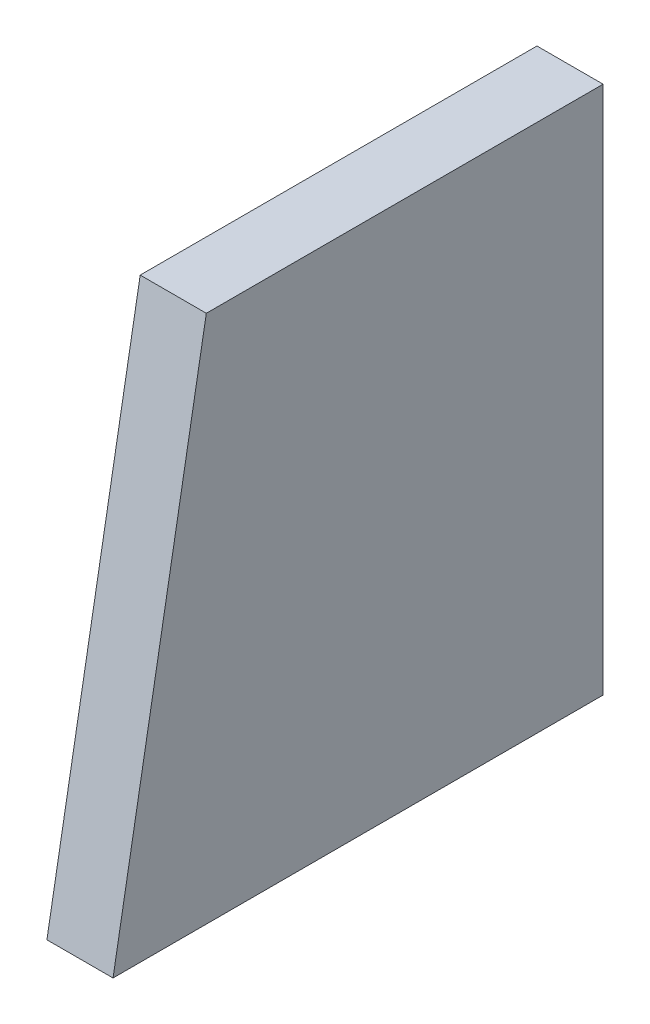
ISO-10303-21;
HEADER;
FILE_DESCRIPTION(('STEP AP214'),'2;1');
FILE_NAME('part.step','',(''),(''),'','','');
FILE_SCHEMA(('AUTOMOTIVE_DESIGN { 1 0 10303 214 1 1 1 1 }'));
ENDSEC;
DATA;
#1=APPLICATION_CONTEXT('core data for automotive mechanical design processes');
#2=APPLICATION_PROTOCOL_DEFINITION('international standard','automotive_design',2000,#1);
#3=PRODUCT_CONTEXT('',#1,'mechanical');
#4=PRODUCT('Part','Part','',(#3));
#5=PRODUCT_RELATED_PRODUCT_CATEGORY('part','',(#4));
#6=PRODUCT_DEFINITION_FORMATION('','',#4);
#7=PRODUCT_DEFINITION_CONTEXT('part definition',#1,'design');
#8=PRODUCT_DEFINITION('design','',#6,#7);
#9=PRODUCT_DEFINITION_SHAPE('','',#8);
#10=(LENGTH_UNIT() NAMED_UNIT(*) SI_UNIT(.MILLI.,.METRE.));
#11=(NAMED_UNIT(*) PLANE_ANGLE_UNIT() SI_UNIT($,.RADIAN.));
#12=(NAMED_UNIT(*) SI_UNIT($,.STERADIAN.) SOLID_ANGLE_UNIT());
#13=UNCERTAINTY_MEASURE_WITH_UNIT(LENGTH_MEASURE(1.E-05),#10,'distance_accuracy_value','');
#14=(GEOMETRIC_REPRESENTATION_CONTEXT(3) GLOBAL_UNCERTAINTY_ASSIGNED_CONTEXT((#13)) GLOBAL_UNIT_ASSIGNED_CONTEXT((#10,
#11,#12)) REPRESENTATION_CONTEXT('',''));
#15=CARTESIAN_POINT('',(0.,0.,0.));
#16=DIRECTION('',(0.,0.,1.));
#17=DIRECTION('',(1.,0.,0.));
#18=AXIS2_PLACEMENT_3D('',#15,#16,#17);
#19=CARTESIAN_POINT('',(6.35,0.,-47.0574106199902));
#20=DIRECTION('',(0.,1.,0.));
#21=DIRECTION('',(0.,0.,1.));
#22=AXIS2_PLACEMENT_3D('',#19,#20,#21);
#23=PLANE('',#22);
#24=DIRECTION('',(0.,0.,-1.));
#25=VECTOR('',#24,1.);
#26=CARTESIAN_POINT('',(0.,0.,-47.0574106199902));
#27=LINE('',#26,#25);
#28=CARTESIAN_POINT('',(0.,0.,0.));
#29=VERTEX_POINT('',#28);
#30=CARTESIAN_POINT('',(0.,0.,-47.0574106199902));
#31=VERTEX_POINT('',#30);
#32=EDGE_CURVE('E96',#29,#31,#27,.T.);
#33=ORIENTED_EDGE('',*,*,#32,.T.);
#34=DIRECTION('',(-1.,0.,0.));
#35=VECTOR('',#34,1.);
#36=CARTESIAN_POINT('',(6.35,0.,-47.0574106199902));
#37=LINE('',#36,#35);
#38=CARTESIAN_POINT('',(6.35,0.,-47.0574106199902));
#39=VERTEX_POINT('',#38);
#40=EDGE_CURVE('E11',#39,#31,#37,.T.);
#41=ORIENTED_EDGE('',*,*,#40,.F.);
#42=DIRECTION('',(0.,0.,-1.));
#43=VECTOR('',#42,1.);
#44=CARTESIAN_POINT('',(6.35,0.,-47.0574106199902));
#45=LINE('',#44,#43);
#46=CARTESIAN_POINT('',(6.35,0.,0.));
#47=VERTEX_POINT('',#46);
#48=EDGE_CURVE('E84',#47,#39,#45,.T.);
#49=ORIENTED_EDGE('',*,*,#48,.F.);
#50=DIRECTION('',(-1.,0.,0.));
#51=VECTOR('',#50,1.);
#52=CARTESIAN_POINT('',(6.35,0.,0.));
#53=LINE('',#52,#51);
#54=EDGE_CURVE('E92',#47,#29,#53,.T.);
#55=ORIENTED_EDGE('',*,*,#54,.T.);
#56=EDGE_LOOP('',(#33,#41,#49,#55));
#57=FACE_BOUND('',#56,.T.);
#58=ADVANCED_FACE('F33',(#57),#23,.F.);
#59=CARTESIAN_POINT('',(6.35,50.8,-47.0574106199902));
#60=DIRECTION('',(0.,0.,1.));
#61=DIRECTION('',(0.,-1.,0.));
#62=AXIS2_PLACEMENT_3D('',#59,#60,#61);
#63=PLANE('',#62);
#64=DIRECTION('',(0.,1.,0.));
#65=VECTOR('',#64,1.);
#66=CARTESIAN_POINT('',(0.,50.8,-47.0574106199902));
#67=LINE('',#66,#65);
#68=CARTESIAN_POINT('',(0.,50.8,-47.0574106199902));
#69=VERTEX_POINT('',#68);
#70=EDGE_CURVE('E88',#31,#69,#67,.T.);
#71=ORIENTED_EDGE('',*,*,#70,.T.);
#72=DIRECTION('',(-1.,0.,0.));
#73=VECTOR('',#72,1.);
#74=CARTESIAN_POINT('',(6.35,50.8,-47.0574106199902));
#75=LINE('',#74,#73);
#76=CARTESIAN_POINT('',(6.35,50.8,-47.0574106199902));
#77=VERTEX_POINT('',#76);
#78=EDGE_CURVE('E41',#77,#69,#75,.T.);
#79=ORIENTED_EDGE('',*,*,#78,.F.);
#80=DIRECTION('',(0.,1.,0.));
#81=VECTOR('',#80,1.);
#82=CARTESIAN_POINT('',(6.35,50.8,-47.0574106199902));
#83=LINE('',#82,#81);
#84=EDGE_CURVE('E79',#39,#77,#83,.T.);
#85=ORIENTED_EDGE('',*,*,#84,.F.);
#86=ORIENTED_EDGE('',*,*,#40,.T.);
#87=EDGE_LOOP('',(#71,#79,#85,#86));
#88=FACE_BOUND('',#87,.T.);
#89=ADVANCED_FACE('F87',(#88),#63,.F.);
#90=CARTESIAN_POINT('',(6.35,50.8,-8.95741061999022));
#91=DIRECTION('',(0.,-1.,0.));
#92=DIRECTION('',(0.,0.,-1.));
#93=AXIS2_PLACEMENT_3D('',#90,#91,#92);
#94=PLANE('',#93);
#95=DIRECTION('',(0.,0.,1.));
#96=VECTOR('',#95,1.);
#97=CARTESIAN_POINT('',(0.,50.8,-8.95741061999022));
#98=LINE('',#97,#96);
#99=CARTESIAN_POINT('',(0.,50.8,-8.95741061999022));
#100=VERTEX_POINT('',#99);
#101=EDGE_CURVE('E66',#69,#100,#98,.T.);
#102=ORIENTED_EDGE('',*,*,#101,.T.);
#103=DIRECTION('',(-1.,0.,0.));
#104=VECTOR('',#103,1.);
#105=CARTESIAN_POINT('',(6.35,50.8,-8.95741061999022));
#106=LINE('',#105,#104);
#107=CARTESIAN_POINT('',(6.35,50.8,-8.95741061999022));
#108=VERTEX_POINT('',#107);
#109=EDGE_CURVE('E89',#108,#100,#106,.T.);
#110=ORIENTED_EDGE('',*,*,#109,.F.);
#111=DIRECTION('',(0.,0.,1.));
#112=VECTOR('',#111,1.);
#113=CARTESIAN_POINT('',(6.35,50.8,-8.95741061999022));
#114=LINE('',#113,#112);
#115=EDGE_CURVE('E82',#77,#108,#114,.T.);
#116=ORIENTED_EDGE('',*,*,#115,.F.);
#117=ORIENTED_EDGE('',*,*,#78,.T.);
#118=EDGE_LOOP('',(#102,#110,#116,#117));
#119=FACE_BOUND('',#118,.T.);
#120=ADVANCED_FACE('F90',(#119),#94,.F.);
#121=CARTESIAN_POINT('',(6.35,0.,0.));
#122=DIRECTION('',(0.,-0.173648177666934,-0.984807753012207));
#123=DIRECTION('',(0.,0.984807753012208,-0.173648177666934));
#124=AXIS2_PLACEMENT_3D('',#121,#122,#123);
#125=PLANE('',#124);
#126=DIRECTION('',(0.,-0.984807753012207,0.173648177666934));
#127=VECTOR('',#126,1.);
#128=CARTESIAN_POINT('',(0.,0.,0.));
#129=LINE('',#128,#127);
#130=EDGE_CURVE('E72',#100,#29,#129,.T.);
#131=ORIENTED_EDGE('',*,*,#130,.T.);
#132=ORIENTED_EDGE('',*,*,#54,.F.);
#133=DIRECTION('',(0.,-0.984807753012207,0.173648177666934));
#134=VECTOR('',#133,1.);
#135=CARTESIAN_POINT('',(6.35,0.,0.));
#136=LINE('',#135,#134);
#137=EDGE_CURVE('E49',#108,#47,#136,.T.);
#138=ORIENTED_EDGE('',*,*,#137,.F.);
#139=ORIENTED_EDGE('',*,*,#109,.T.);
#140=EDGE_LOOP('',(#131,#132,#138,#139));
#141=FACE_BOUND('',#140,.T.);
#142=ADVANCED_FACE('F103',(#141),#125,.F.);
#143=CARTESIAN_POINT('',(6.35,0.,0.));
#144=DIRECTION('',(1.,0.,0.));
#145=DIRECTION('',(0.,0.,-1.));
#146=AXIS2_PLACEMENT_3D('',#143,#144,#145);
#147=PLANE('',#146);
#148=ORIENTED_EDGE('',*,*,#48,.T.);
#149=ORIENTED_EDGE('',*,*,#84,.T.);
#150=ORIENTED_EDGE('',*,*,#115,.T.);
#151=ORIENTED_EDGE('',*,*,#137,.T.);
#152=EDGE_LOOP('',(#148,#149,#150,#151));
#153=FACE_BOUND('',#152,.T.);
#154=ADVANCED_FACE('F80',(#153),#147,.T.);
#155=CARTESIAN_POINT('',(0.,0.,0.));
#156=DIRECTION('',(1.,0.,0.));
#157=DIRECTION('',(0.,0.,-1.));
#158=AXIS2_PLACEMENT_3D('',#155,#156,#157);
#159=PLANE('',#158);
#160=ORIENTED_EDGE('',*,*,#32,.F.);
#161=ORIENTED_EDGE('',*,*,#130,.F.);
#162=ORIENTED_EDGE('',*,*,#101,.F.);
#163=ORIENTED_EDGE('',*,*,#70,.F.);
#164=EDGE_LOOP('',(#160,#161,#162,#163));
#165=FACE_BOUND('',#164,.T.);
#166=ADVANCED_FACE('F106',(#165),#159,.F.);
#167=CLOSED_SHELL('',(#58,#89,#120,#142,#154,#166));
#168=MANIFOLD_SOLID_BREP('B2',#167);
#169=ADVANCED_BREP_SHAPE_REPRESENTATION('',(#18,#168),#14);
#170=SHAPE_DEFINITION_REPRESENTATION(#9,#169);
ENDSEC;
END-ISO-10303-21;
